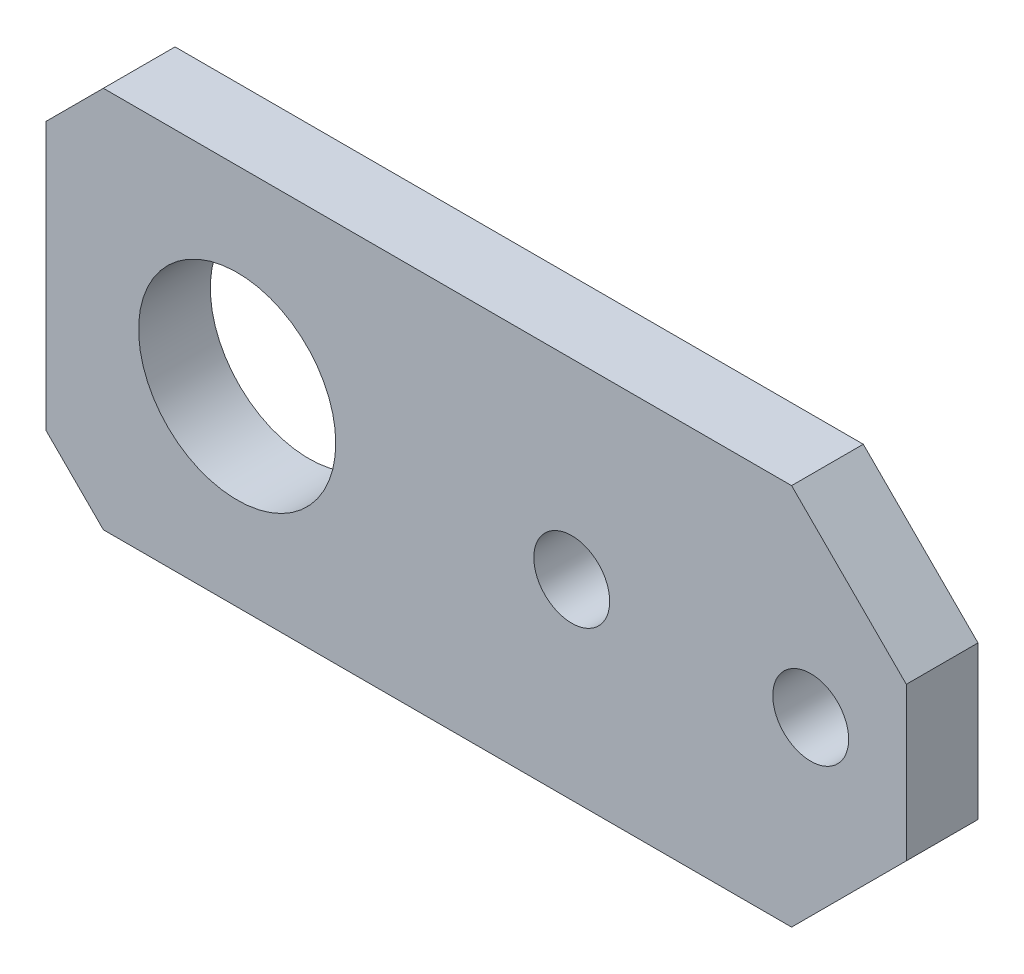
ISO-10303-21;
HEADER;
FILE_DESCRIPTION(('STEP AP214'),'2;1');
FILE_NAME('part.step','',(''),(''),'','','');
FILE_SCHEMA(('AUTOMOTIVE_DESIGN { 1 0 10303 214 1 1 1 1 }'));
ENDSEC;
DATA;
#1=APPLICATION_CONTEXT('core data for automotive mechanical design processes');
#2=APPLICATION_PROTOCOL_DEFINITION('international standard','automotive_design',2000,#1);
#3=PRODUCT_CONTEXT('',#1,'mechanical');
#4=PRODUCT('Part','Part','',(#3));
#5=PRODUCT_RELATED_PRODUCT_CATEGORY('part','',(#4));
#6=PRODUCT_DEFINITION_FORMATION('','',#4);
#7=PRODUCT_DEFINITION_CONTEXT('part definition',#1,'design');
#8=PRODUCT_DEFINITION('design','',#6,#7);
#9=PRODUCT_DEFINITION_SHAPE('','',#8);
#10=(LENGTH_UNIT() NAMED_UNIT(*) SI_UNIT(.MILLI.,.METRE.));
#11=(NAMED_UNIT(*) PLANE_ANGLE_UNIT() SI_UNIT($,.RADIAN.));
#12=(NAMED_UNIT(*) SI_UNIT($,.STERADIAN.) SOLID_ANGLE_UNIT());
#13=UNCERTAINTY_MEASURE_WITH_UNIT(LENGTH_MEASURE(1.E-05),#10,'distance_accuracy_value','');
#14=(GEOMETRIC_REPRESENTATION_CONTEXT(3) GLOBAL_UNCERTAINTY_ASSIGNED_CONTEXT((#13)) GLOBAL_UNIT_ASSIGNED_CONTEXT((#10,
#11,#12)) REPRESENTATION_CONTEXT('',''));
#15=CARTESIAN_POINT('',(0.,0.,0.));
#16=DIRECTION('',(0.,0.,1.));
#17=DIRECTION('',(1.,0.,0.));
#18=AXIS2_PLACEMENT_3D('',#15,#16,#17);
#19=CARTESIAN_POINT('',(57.15,-25.4,9.525));
#20=DIRECTION('',(-1.,0.,0.));
#21=DIRECTION('',(0.,0.,1.));
#22=AXIS2_PLACEMENT_3D('',#19,#20,#21);
#23=PLANE('',#22);
#24=DIRECTION('',(0.,1.,0.));
#25=VECTOR('',#24,1.);
#26=CARTESIAN_POINT('',(57.15,-25.4,0.));
#27=LINE('',#26,#25);
#28=CARTESIAN_POINT('',(57.15,-10.16,0.));
#29=VERTEX_POINT('',#28);
#30=CARTESIAN_POINT('',(57.15,10.1599999999999,0.));
#31=VERTEX_POINT('',#30);
#32=EDGE_CURVE('E168',#29,#31,#27,.T.);
#33=ORIENTED_EDGE('',*,*,#32,.T.);
#34=DIRECTION('',(0.,0.,1.));
#35=VECTOR('',#34,1.);
#36=CARTESIAN_POINT('',(57.15,10.1599999999999,9.525));
#37=LINE('',#36,#35);
#38=CARTESIAN_POINT('',(57.15,10.1599999999999,9.525));
#39=VERTEX_POINT('',#38);
#40=EDGE_CURVE('E56',#31,#39,#37,.T.);
#41=ORIENTED_EDGE('',*,*,#40,.T.);
#42=DIRECTION('',(0.,1.,0.));
#43=VECTOR('',#42,1.);
#44=CARTESIAN_POINT('',(57.15,-25.4,9.525));
#45=LINE('',#44,#43);
#46=CARTESIAN_POINT('',(57.15,-10.16,9.525));
#47=VERTEX_POINT('',#46);
#48=EDGE_CURVE('E123',#47,#39,#45,.T.);
#49=ORIENTED_EDGE('',*,*,#48,.F.);
#50=DIRECTION('',(0.,0.,-1.));
#51=VECTOR('',#50,1.);
#52=CARTESIAN_POINT('',(57.15,-10.16,9.525));
#53=LINE('',#52,#51);
#54=EDGE_CURVE('E150',#47,#29,#53,.T.);
#55=ORIENTED_EDGE('',*,*,#54,.T.);
#56=EDGE_LOOP('',(#33,#41,#49,#55));
#57=FACE_BOUND('',#56,.T.);
#58=ADVANCED_FACE('F35',(#57),#23,.F.);
#59=CARTESIAN_POINT('',(-57.15,25.4,9.525));
#60=DIRECTION('',(0.,-1.,0.));
#61=DIRECTION('',(0.,0.,-1.));
#62=AXIS2_PLACEMENT_3D('',#59,#60,#61);
#63=PLANE('',#62);
#64=DIRECTION('',(-1.,0.,0.));
#65=VECTOR('',#64,1.);
#66=CARTESIAN_POINT('',(-57.15,25.4,9.525));
#67=LINE('',#66,#65);
#68=CARTESIAN_POINT('',(41.91,25.4,9.525));
#69=VERTEX_POINT('',#68);
#70=CARTESIAN_POINT('',(-49.5299999999999,25.4,9.525));
#71=VERTEX_POINT('',#70);
#72=EDGE_CURVE('E126',#69,#71,#67,.T.);
#73=ORIENTED_EDGE('',*,*,#72,.F.);
#74=DIRECTION('',(0.,0.,-1.));
#75=VECTOR('',#74,1.);
#76=CARTESIAN_POINT('',(41.91,25.4,9.525));
#77=LINE('',#76,#75);
#78=CARTESIAN_POINT('',(41.91,25.4,0.));
#79=VERTEX_POINT('',#78);
#80=EDGE_CURVE('E144',#69,#79,#77,.T.);
#81=ORIENTED_EDGE('',*,*,#80,.T.);
#82=DIRECTION('',(-1.,0.,0.));
#83=VECTOR('',#82,1.);
#84=CARTESIAN_POINT('',(-57.15,25.4,0.));
#85=LINE('',#84,#83);
#86=CARTESIAN_POINT('',(-49.5299999999999,25.4,0.));
#87=VERTEX_POINT('',#86);
#88=EDGE_CURVE('E128',#79,#87,#85,.T.);
#89=ORIENTED_EDGE('',*,*,#88,.T.);
#90=DIRECTION('',(0.,0.,1.));
#91=VECTOR('',#90,1.);
#92=CARTESIAN_POINT('',(-49.5299999999999,25.4,9.525));
#93=LINE('',#92,#91);
#94=EDGE_CURVE('E141',#87,#71,#93,.T.);
#95=ORIENTED_EDGE('',*,*,#94,.T.);
#96=EDGE_LOOP('',(#73,#81,#89,#95));
#97=FACE_BOUND('',#96,.T.);
#98=ADVANCED_FACE('F162',(#97),#63,.F.);
#99=CARTESIAN_POINT('',(-57.15,-25.4,9.525));
#100=DIRECTION('',(1.,0.,0.));
#101=DIRECTION('',(0.,0.,-1.));
#102=AXIS2_PLACEMENT_3D('',#99,#100,#101);
#103=PLANE('',#102);
#104=DIRECTION('',(0.,-1.,0.));
#105=VECTOR('',#104,1.);
#106=CARTESIAN_POINT('',(-57.15,-25.4,0.));
#107=LINE('',#106,#105);
#108=CARTESIAN_POINT('',(-57.15,17.78,0.));
#109=VERTEX_POINT('',#108);
#110=CARTESIAN_POINT('',(-57.15,-17.78,0.));
#111=VERTEX_POINT('',#110);
#112=EDGE_CURVE('E124',#109,#111,#107,.T.);
#113=ORIENTED_EDGE('',*,*,#112,.T.);
#114=DIRECTION('',(0.,0.,1.));
#115=VECTOR('',#114,1.);
#116=CARTESIAN_POINT('',(-57.15,-17.78,9.525));
#117=LINE('',#116,#115);
#118=CARTESIAN_POINT('',(-57.15,-17.78,9.525));
#119=VERTEX_POINT('',#118);
#120=EDGE_CURVE('E107',#111,#119,#117,.T.);
#121=ORIENTED_EDGE('',*,*,#120,.T.);
#122=DIRECTION('',(0.,-1.,0.));
#123=VECTOR('',#122,1.);
#124=CARTESIAN_POINT('',(-57.15,-25.4,9.525));
#125=LINE('',#124,#123);
#126=CARTESIAN_POINT('',(-57.15,17.78,9.525));
#127=VERTEX_POINT('',#126);
#128=EDGE_CURVE('E165',#127,#119,#125,.T.);
#129=ORIENTED_EDGE('',*,*,#128,.F.);
#130=DIRECTION('',(0.,0.,-1.));
#131=VECTOR('',#130,1.);
#132=CARTESIAN_POINT('',(-57.15,17.78,9.525));
#133=LINE('',#132,#131);
#134=EDGE_CURVE('E112',#127,#109,#133,.T.);
#135=ORIENTED_EDGE('',*,*,#134,.T.);
#136=EDGE_LOOP('',(#113,#121,#129,#135));
#137=FACE_BOUND('',#136,.T.);
#138=ADVANCED_FACE('F222',(#137),#103,.F.);
#139=CARTESIAN_POINT('',(-57.15,-25.4,9.525));
#140=DIRECTION('',(0.,1.,0.));
#141=DIRECTION('',(0.,0.,1.));
#142=AXIS2_PLACEMENT_3D('',#139,#140,#141);
#143=PLANE('',#142);
#144=DIRECTION('',(1.,0.,0.));
#145=VECTOR('',#144,1.);
#146=CARTESIAN_POINT('',(-57.15,-25.4,0.));
#147=LINE('',#146,#145);
#148=CARTESIAN_POINT('',(-49.53,-25.4,0.));
#149=VERTEX_POINT('',#148);
#150=CARTESIAN_POINT('',(41.91,-25.4,0.));
#151=VERTEX_POINT('',#150);
#152=EDGE_CURVE('E116',#149,#151,#147,.T.);
#153=ORIENTED_EDGE('',*,*,#152,.T.);
#154=DIRECTION('',(0.,0.,1.));
#155=VECTOR('',#154,1.);
#156=CARTESIAN_POINT('',(41.91,-25.4,9.525));
#157=LINE('',#156,#155);
#158=CARTESIAN_POINT('',(41.91,-25.4,9.525));
#159=VERTEX_POINT('',#158);
#160=EDGE_CURVE('E11',#151,#159,#157,.T.);
#161=ORIENTED_EDGE('',*,*,#160,.T.);
#162=DIRECTION('',(1.,0.,0.));
#163=VECTOR('',#162,1.);
#164=CARTESIAN_POINT('',(-57.15,-25.4,9.525));
#165=LINE('',#164,#163);
#166=CARTESIAN_POINT('',(-49.53,-25.4,9.525));
#167=VERTEX_POINT('',#166);
#168=EDGE_CURVE('E117',#167,#159,#165,.T.);
#169=ORIENTED_EDGE('',*,*,#168,.F.);
#170=DIRECTION('',(0.,0.,-1.));
#171=VECTOR('',#170,1.);
#172=CARTESIAN_POINT('',(-49.53,-25.4,9.525));
#173=LINE('',#172,#171);
#174=EDGE_CURVE('E106',#167,#149,#173,.T.);
#175=ORIENTED_EDGE('',*,*,#174,.T.);
#176=EDGE_LOOP('',(#153,#161,#169,#175));
#177=FACE_BOUND('',#176,.T.);
#178=ADVANCED_FACE('F115',(#177),#143,.F.);
#179=CARTESIAN_POINT('',(0.,0.,9.525));
#180=DIRECTION('',(0.,0.,-1.));
#181=DIRECTION('',(-1.,0.,0.));
#182=AXIS2_PLACEMENT_3D('',#179,#180,#181);
#183=PLANE('',#182);
#184=CARTESIAN_POINT('',(-31.75,0.,9.525));
#185=DIRECTION('',(0.,0.,1.));
#186=DIRECTION('',(1.,0.,0.));
#187=AXIS2_PLACEMENT_3D('',#184,#185,#186);
#188=CIRCLE('',#187,13.09624);
#189=CARTESIAN_POINT('',(-18.65376,0.,9.525));
#190=VERTEX_POINT('',#189);
#191=EDGE_CURVE('E190',#190,#190,#188,.T.);
#192=ORIENTED_EDGE('',*,*,#191,.F.);
#193=EDGE_LOOP('',(#192));
#194=FACE_BOUND('',#193,.T.);
#195=CARTESIAN_POINT('',(44.45,0.,9.525));
#196=DIRECTION('',(0.,0.,1.));
#197=DIRECTION('',(1.,0.,0.));
#198=AXIS2_PLACEMENT_3D('',#195,#196,#197);
#199=CIRCLE('',#198,5.04189999999999);
#200=CARTESIAN_POINT('',(49.4919,0.,9.525));
#201=VERTEX_POINT('',#200);
#202=EDGE_CURVE('E184',#201,#201,#199,.T.);
#203=ORIENTED_EDGE('',*,*,#202,.F.);
#204=EDGE_LOOP('',(#203));
#205=FACE_BOUND('',#204,.T.);
#206=CARTESIAN_POINT('',(12.7,0.,9.525));
#207=DIRECTION('',(0.,0.,1.));
#208=DIRECTION('',(1.,0.,0.));
#209=AXIS2_PLACEMENT_3D('',#206,#207,#208);
#210=CIRCLE('',#209,5.04189999999999);
#211=CARTESIAN_POINT('',(17.7419,0.,9.525));
#212=VERTEX_POINT('',#211);
#213=EDGE_CURVE('E173',#212,#212,#210,.T.);
#214=ORIENTED_EDGE('',*,*,#213,.F.);
#215=EDGE_LOOP('',(#214));
#216=FACE_BOUND('',#215,.T.);
#217=ORIENTED_EDGE('',*,*,#48,.T.);
#218=DIRECTION('',(0.707106781186547,-0.707106781186548,0.));
#219=VECTOR('',#218,1.);
#220=CARTESIAN_POINT('',(41.91,25.4,9.525));
#221=LINE('',#220,#219);
#222=EDGE_CURVE('E43',#39,#69,#221,.F.);
#223=ORIENTED_EDGE('',*,*,#222,.T.);
#224=ORIENTED_EDGE('',*,*,#72,.T.);
#225=DIRECTION('',(0.707106781186549,0.707106781186546,0.));
#226=VECTOR('',#225,1.);
#227=CARTESIAN_POINT('',(-57.15,17.78,9.525));
#228=LINE('',#227,#226);
#229=EDGE_CURVE('E137',#71,#127,#228,.F.);
#230=ORIENTED_EDGE('',*,*,#229,.T.);
#231=ORIENTED_EDGE('',*,*,#128,.T.);
#232=DIRECTION('',(-0.707106781186546,0.707106781186549,0.));
#233=VECTOR('',#232,1.);
#234=CARTESIAN_POINT('',(-49.53,-25.4,9.525));
#235=LINE('',#234,#233);
#236=EDGE_CURVE('E139',#119,#167,#235,.F.);
#237=ORIENTED_EDGE('',*,*,#236,.T.);
#238=ORIENTED_EDGE('',*,*,#168,.T.);
#239=DIRECTION('',(-0.707106781186549,-0.707106781186546,0.));
#240=VECTOR('',#239,1.);
#241=CARTESIAN_POINT('',(57.15,-10.16,9.525));
#242=LINE('',#241,#240);
#243=EDGE_CURVE('E154',#159,#47,#242,.F.);
#244=ORIENTED_EDGE('',*,*,#243,.T.);
#245=EDGE_LOOP('',(#217,#223,#224,#230,#231,#237,#238,#244));
#246=FACE_BOUND('',#245,.T.);
#247=ADVANCED_FACE('F158',(#194,#205,#216,#246),#183,.F.);
#248=CARTESIAN_POINT('',(0.,0.,0.));
#249=DIRECTION('',(0.,0.,-1.));
#250=DIRECTION('',(-1.,0.,0.));
#251=AXIS2_PLACEMENT_3D('',#248,#249,#250);
#252=PLANE('',#251);
#253=CARTESIAN_POINT('',(-31.75,0.,0.));
#254=DIRECTION('',(0.,0.,1.));
#255=DIRECTION('',(1.,0.,0.));
#256=AXIS2_PLACEMENT_3D('',#253,#254,#255);
#257=CIRCLE('',#256,13.09624);
#258=CARTESIAN_POINT('',(-18.65376,0.,0.));
#259=VERTEX_POINT('',#258);
#260=EDGE_CURVE('E187',#259,#259,#257,.T.);
#261=ORIENTED_EDGE('',*,*,#260,.T.);
#262=EDGE_LOOP('',(#261));
#263=FACE_BOUND('',#262,.T.);
#264=CARTESIAN_POINT('',(44.45,0.,0.));
#265=DIRECTION('',(0.,0.,1.));
#266=DIRECTION('',(1.,0.,0.));
#267=AXIS2_PLACEMENT_3D('',#264,#265,#266);
#268=CIRCLE('',#267,5.04189999999999);
#269=CARTESIAN_POINT('',(49.4919,0.,0.));
#270=VERTEX_POINT('',#269);
#271=EDGE_CURVE('E181',#270,#270,#268,.T.);
#272=ORIENTED_EDGE('',*,*,#271,.T.);
#273=EDGE_LOOP('',(#272));
#274=FACE_BOUND('',#273,.T.);
#275=CARTESIAN_POINT('',(12.7,0.,0.));
#276=DIRECTION('',(0.,0.,1.));
#277=DIRECTION('',(1.,0.,0.));
#278=AXIS2_PLACEMENT_3D('',#275,#276,#277);
#279=CIRCLE('',#278,5.04189999999999);
#280=CARTESIAN_POINT('',(17.7419,0.,0.));
#281=VERTEX_POINT('',#280);
#282=EDGE_CURVE('E170',#281,#281,#279,.T.);
#283=ORIENTED_EDGE('',*,*,#282,.T.);
#284=EDGE_LOOP('',(#283));
#285=FACE_BOUND('',#284,.T.);
#286=ORIENTED_EDGE('',*,*,#88,.F.);
#287=DIRECTION('',(-0.707106781186547,0.707106781186548,0.));
#288=VECTOR('',#287,1.);
#289=CARTESIAN_POINT('',(33.6550000000001,33.655,0.));
#290=LINE('',#289,#288);
#291=EDGE_CURVE('E148',#79,#31,#290,.F.);
#292=ORIENTED_EDGE('',*,*,#291,.T.);
#293=ORIENTED_EDGE('',*,*,#32,.F.);
#294=DIRECTION('',(0.707106781186549,0.707106781186546,0.));
#295=VECTOR('',#294,1.);
#296=CARTESIAN_POINT('',(33.6549999999999,-33.655,0.));
#297=LINE('',#296,#295);
#298=EDGE_CURVE('E122',#29,#151,#297,.F.);
#299=ORIENTED_EDGE('',*,*,#298,.T.);
#300=ORIENTED_EDGE('',*,*,#152,.F.);
#301=DIRECTION('',(0.707106781186546,-0.707106781186549,0.));
#302=VECTOR('',#301,1.);
#303=CARTESIAN_POINT('',(-37.4650000000001,-37.4649999999999,0.));
#304=LINE('',#303,#302);
#305=EDGE_CURVE('E102',#149,#111,#304,.F.);
#306=ORIENTED_EDGE('',*,*,#305,.T.);
#307=ORIENTED_EDGE('',*,*,#112,.F.);
#308=DIRECTION('',(-0.707106781186549,-0.707106781186546,0.));
#309=VECTOR('',#308,1.);
#310=CARTESIAN_POINT('',(-37.4649999999999,37.465,0.));
#311=LINE('',#310,#309);
#312=EDGE_CURVE('E113',#109,#87,#311,.F.);
#313=ORIENTED_EDGE('',*,*,#312,.T.);
#314=EDGE_LOOP('',(#286,#292,#293,#299,#300,#306,#307,#313));
#315=FACE_BOUND('',#314,.T.);
#316=ADVANCED_FACE('F120',(#263,#274,#285,#315),#252,.T.);
#317=CARTESIAN_POINT('',(12.7,0.,9.525));
#318=DIRECTION('',(0.,0.,1.));
#319=DIRECTION('',(1.,0.,0.));
#320=AXIS2_PLACEMENT_3D('',#317,#318,#319);
#321=CYLINDRICAL_SURFACE('',#320,5.04189999999999);
#322=ORIENTED_EDGE('',*,*,#282,.F.);
#323=EDGE_LOOP('',(#322));
#324=FACE_BOUND('',#323,.T.);
#325=ORIENTED_EDGE('',*,*,#213,.T.);
#326=EDGE_LOOP('',(#325));
#327=FACE_BOUND('',#326,.T.);
#328=ADVANCED_FACE('F203',(#324,#327),#321,.F.);
#329=CARTESIAN_POINT('',(44.45,0.,9.525));
#330=DIRECTION('',(0.,0.,1.));
#331=DIRECTION('',(1.,0.,0.));
#332=AXIS2_PLACEMENT_3D('',#329,#330,#331);
#333=CYLINDRICAL_SURFACE('',#332,5.04189999999999);
#334=ORIENTED_EDGE('',*,*,#271,.F.);
#335=EDGE_LOOP('',(#334));
#336=FACE_BOUND('',#335,.T.);
#337=ORIENTED_EDGE('',*,*,#202,.T.);
#338=EDGE_LOOP('',(#337));
#339=FACE_BOUND('',#338,.T.);
#340=ADVANCED_FACE('F205',(#336,#339),#333,.F.);
#341=CARTESIAN_POINT('',(-31.75,0.,9.525));
#342=DIRECTION('',(0.,0.,1.));
#343=DIRECTION('',(1.,0.,0.));
#344=AXIS2_PLACEMENT_3D('',#341,#342,#343);
#345=CYLINDRICAL_SURFACE('',#344,13.09624);
#346=ORIENTED_EDGE('',*,*,#260,.F.);
#347=EDGE_LOOP('',(#346));
#348=FACE_BOUND('',#347,.T.);
#349=ORIENTED_EDGE('',*,*,#191,.T.);
#350=EDGE_LOOP('',(#349));
#351=FACE_BOUND('',#350,.T.);
#352=ADVANCED_FACE('F194',(#348,#351),#345,.F.);
#353=CARTESIAN_POINT('',(-49.53,-25.4,9.525));
#354=DIRECTION('',(0.707106781186549,0.707106781186546,0.));
#355=DIRECTION('',(0.,0.,-1.));
#356=AXIS2_PLACEMENT_3D('',#353,#354,#355);
#357=PLANE('',#356);
#358=ORIENTED_EDGE('',*,*,#236,.F.);
#359=ORIENTED_EDGE('',*,*,#120,.F.);
#360=ORIENTED_EDGE('',*,*,#305,.F.);
#361=ORIENTED_EDGE('',*,*,#174,.F.);
#362=EDGE_LOOP('',(#358,#359,#360,#361));
#363=FACE_BOUND('',#362,.T.);
#364=ADVANCED_FACE('F105',(#363),#357,.F.);
#365=CARTESIAN_POINT('',(-57.15,17.78,9.525));
#366=DIRECTION('',(0.707106781186546,-0.707106781186549,0.));
#367=DIRECTION('',(0.,0.,-1.));
#368=AXIS2_PLACEMENT_3D('',#365,#366,#367);
#369=PLANE('',#368);
#370=ORIENTED_EDGE('',*,*,#229,.F.);
#371=ORIENTED_EDGE('',*,*,#94,.F.);
#372=ORIENTED_EDGE('',*,*,#312,.F.);
#373=ORIENTED_EDGE('',*,*,#134,.F.);
#374=EDGE_LOOP('',(#370,#371,#372,#373));
#375=FACE_BOUND('',#374,.T.);
#376=ADVANCED_FACE('F228',(#375),#369,.F.);
#377=CARTESIAN_POINT('',(41.91,25.4,9.525));
#378=DIRECTION('',(-0.707106781186548,-0.707106781186547,0.));
#379=DIRECTION('',(0.,0.,-1.));
#380=AXIS2_PLACEMENT_3D('',#377,#378,#379);
#381=PLANE('',#380);
#382=ORIENTED_EDGE('',*,*,#222,.F.);
#383=ORIENTED_EDGE('',*,*,#40,.F.);
#384=ORIENTED_EDGE('',*,*,#291,.F.);
#385=ORIENTED_EDGE('',*,*,#80,.F.);
#386=EDGE_LOOP('',(#382,#383,#384,#385));
#387=FACE_BOUND('',#386,.T.);
#388=ADVANCED_FACE('F167',(#387),#381,.F.);
#389=CARTESIAN_POINT('',(57.15,-10.16,9.525));
#390=DIRECTION('',(-0.707106781186546,0.707106781186549,0.));
#391=DIRECTION('',(0.,0.,-1.));
#392=AXIS2_PLACEMENT_3D('',#389,#390,#391);
#393=PLANE('',#392);
#394=ORIENTED_EDGE('',*,*,#243,.F.);
#395=ORIENTED_EDGE('',*,*,#160,.F.);
#396=ORIENTED_EDGE('',*,*,#298,.F.);
#397=ORIENTED_EDGE('',*,*,#54,.F.);
#398=EDGE_LOOP('',(#394,#395,#396,#397));
#399=FACE_BOUND('',#398,.T.);
#400=ADVANCED_FACE('F37',(#399),#393,.F.);
#401=CLOSED_SHELL('',(#58,#98,#138,#178,#247,#316,#328,#340,#352,#364,#376,#388,#400));
#402=MANIFOLD_SOLID_BREP('B2',#401);
#403=ADVANCED_BREP_SHAPE_REPRESENTATION('',(#18,#402),#14);
#404=SHAPE_DEFINITION_REPRESENTATION(#9,#403);
ENDSEC;
END-ISO-10303-21;
